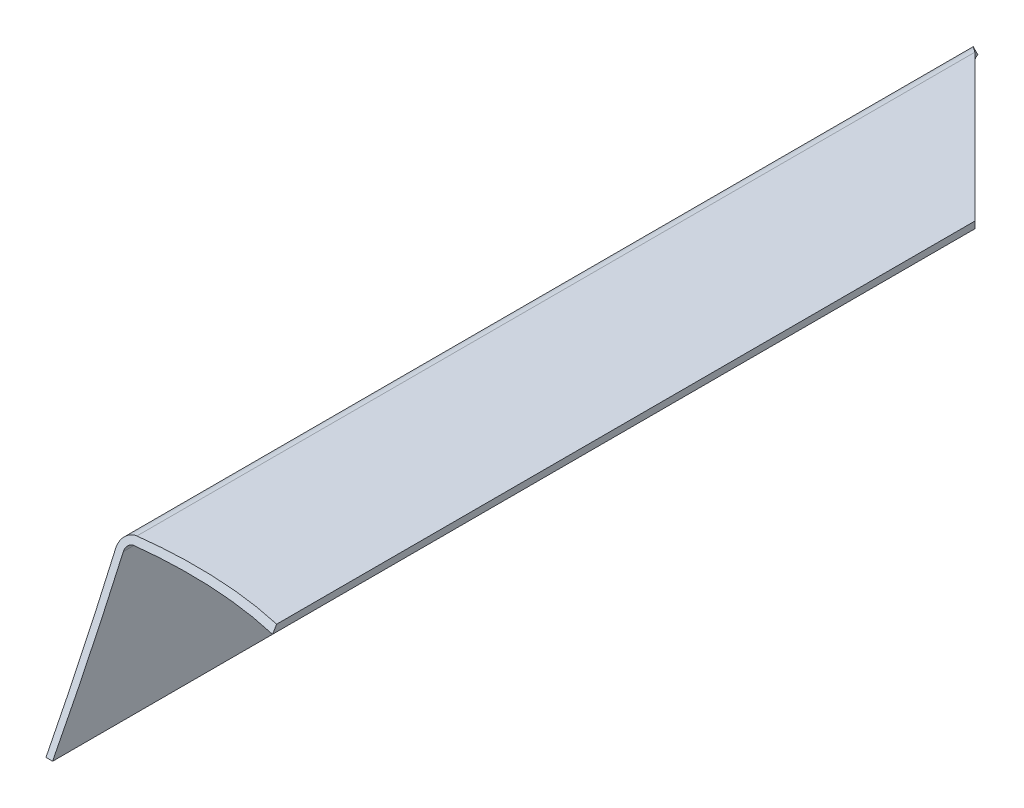
ISO-10303-21;
HEADER;
FILE_DESCRIPTION(('STEP AP214'),'2;1');
FILE_NAME('part.step','',(''),(''),'','','');
FILE_SCHEMA(('AUTOMOTIVE_DESIGN { 1 0 10303 214 1 1 1 1 }'));
ENDSEC;
DATA;
#1=APPLICATION_CONTEXT('core data for automotive mechanical design processes');
#2=APPLICATION_PROTOCOL_DEFINITION('international standard','automotive_design',2000,#1);
#3=PRODUCT_CONTEXT('',#1,'mechanical');
#4=PRODUCT('Part','Part','',(#3));
#5=PRODUCT_RELATED_PRODUCT_CATEGORY('part','',(#4));
#6=PRODUCT_DEFINITION_FORMATION('','',#4);
#7=PRODUCT_DEFINITION_CONTEXT('part definition',#1,'design');
#8=PRODUCT_DEFINITION('design','',#6,#7);
#9=PRODUCT_DEFINITION_SHAPE('','',#8);
#10=(LENGTH_UNIT() NAMED_UNIT(*) SI_UNIT(.MILLI.,.METRE.));
#11=(NAMED_UNIT(*) PLANE_ANGLE_UNIT() SI_UNIT($,.RADIAN.));
#12=(NAMED_UNIT(*) SI_UNIT($,.STERADIAN.) SOLID_ANGLE_UNIT());
#13=UNCERTAINTY_MEASURE_WITH_UNIT(LENGTH_MEASURE(1.E-05),#10,'distance_accuracy_value','');
#14=(GEOMETRIC_REPRESENTATION_CONTEXT(3) GLOBAL_UNCERTAINTY_ASSIGNED_CONTEXT((#13)) GLOBAL_UNIT_ASSIGNED_CONTEXT((#10,
#11,#12)) REPRESENTATION_CONTEXT('',''));
#15=CARTESIAN_POINT('',(0.,0.,0.));
#16=DIRECTION('',(0.,0.,1.));
#17=DIRECTION('',(1.,0.,0.));
#18=AXIS2_PLACEMENT_3D('',#15,#16,#17);
#19=CARTESIAN_POINT('',(-75.3461789999995,0.188336430725022,0.));
#20=DIRECTION('',(-1.,0.,0.));
#21=DIRECTION('',(0.,0.,1.));
#22=AXIS2_PLACEMENT_3D('',#19,#20,#21);
#23=PLANE('',#22);
#24=CARTESIAN_POINT('',(-75.3461790000001,80.0720931223183,64.9810127583872));
#25=DIRECTION('',(-1.,0.,0.));
#26=DIRECTION('',(0.,-0.892228166379723,0.451584874767389));
#27=AXIS2_PLACEMENT_3D('',#24,#25,#26);
#28=ELLIPSE('',#27,110.282499709762,44.45);
#29=CARTESIAN_POINT('',(-75.346179,73.8729789999997,18.7832321067135));
#30=VERTEX_POINT('',#29);
#31=CARTESIAN_POINT('',(-75.3461789999999,57.8815154307375,26.4048597394044));
#32=VERTEX_POINT('',#31);
#33=EDGE_CURVE('E103',#30,#32,#28,.T.);
#34=ORIENTED_EDGE('',*,*,#33,.F.);
#35=DIRECTION('',(0.,0.,-1.));
#36=VECTOR('',#35,1.);
#37=CARTESIAN_POINT('',(-75.346179,73.8729789999997,0.));
#38=LINE('',#37,#36);
#39=CARTESIAN_POINT('',(-75.346179,73.8729789999998,-73.6846425692606));
#40=VERTEX_POINT('',#39);
#41=EDGE_CURVE('E41',#30,#40,#38,.T.);
#42=ORIENTED_EDGE('',*,*,#41,.T.);
#43=DIRECTION('',(0.,0.707106781186615,-0.70710678118648));
#44=VECTOR('',#43,1.);
#45=CARTESIAN_POINT('',(-75.346179,74.7407654307376,-74.5524289999983));
#46=LINE('',#45,#44);
#47=CARTESIAN_POINT('',(-75.3461789999999,57.8815154307376,-57.6931790000015));
#48=VERTEX_POINT('',#47);
#49=EDGE_CURVE('E135',#48,#40,#46,.T.);
#50=ORIENTED_EDGE('',*,*,#49,.F.);
#51=DIRECTION('',(0.,0.,-1.));
#52=VECTOR('',#51,1.);
#53=CARTESIAN_POINT('',(-75.3461789999999,57.8815154307375,57.6931790000015));
#54=LINE('',#53,#52);
#55=EDGE_CURVE('E108',#32,#48,#54,.T.);
#56=ORIENTED_EDGE('',*,*,#55,.F.);
#57=EDGE_LOOP('',(#34,#42,#50,#56));
#58=FACE_BOUND('',#57,.T.);
#59=ADVANCED_FACE('F32',(#58),#23,.T.);
#60=CARTESIAN_POINT('',(-74.6095789999999,57.8815154307375,57.6931790000015));
#61=DIRECTION('',(0.,1.,0.));
#62=DIRECTION('',(0.,0.,1.));
#63=AXIS2_PLACEMENT_3D('',#60,#61,#62);
#64=PLANE('',#63);
#65=DIRECTION('',(0.,0.,-1.));
#66=VECTOR('',#65,1.);
#67=CARTESIAN_POINT('',(-74.6095789999999,57.8815154307375,57.6931790000015));
#68=LINE('',#67,#66);
#69=CARTESIAN_POINT('',(-74.6095789999999,57.8815154307375,26.4270617637596));
#70=VERTEX_POINT('',#69);
#71=CARTESIAN_POINT('',(-74.6095789999999,57.8815154307376,-57.6931790000015));
#72=VERTEX_POINT('',#71);
#73=EDGE_CURVE('E137',#70,#72,#68,.T.);
#74=ORIENTED_EDGE('',*,*,#73,.F.);
#75=CARTESIAN_POINT('',(-86.2996938358006,57.8815154307375,76.2123654834745));
#76=DIRECTION('',(0.,1.,0.));
#77=DIRECTION('',(-0.698196395740364,0.,0.715906273876103));
#78=AXIS2_PLACEMENT_3D('',#75,#76,#77);
#79=ELLIPSE('',#78,54.436662870583,44.45);
#80=EDGE_CURVE('E224',#70,#32,#79,.T.);
#81=ORIENTED_EDGE('',*,*,#80,.T.);
#82=ORIENTED_EDGE('',*,*,#55,.T.);
#83=DIRECTION('',(-1.,0.,0.));
#84=VECTOR('',#83,1.);
#85=CARTESIAN_POINT('',(-74.6095789999999,57.8815154307376,-57.6931790000015));
#86=LINE('',#85,#84);
#87=EDGE_CURVE('E338',#72,#48,#86,.T.);
#88=ORIENTED_EDGE('',*,*,#87,.F.);
#89=EDGE_LOOP('',(#74,#81,#82,#88));
#90=FACE_BOUND('',#89,.T.);
#91=ADVANCED_FACE('F156',(#90),#64,.F.);
#92=CARTESIAN_POINT('',(-74.609579,74.7407654307376,-74.5524289999983));
#93=DIRECTION('',(0.,0.70710678118648,0.707106781186615));
#94=DIRECTION('',(0.,-0.707106781186615,0.70710678118648));
#95=AXIS2_PLACEMENT_3D('',#92,#93,#94);
#96=PLANE('',#95);
#97=CARTESIAN_POINT('',(-74.609579,73.8729789999998,-73.6846425692607));
#98=CARTESIAN_POINT('',(-75.346179,73.8729789999998,-73.6846425692607));
#99=B_SPLINE_CURVE_WITH_KNOTS('',1,(#97,#98),.UNSPECIFIED.,.F.,.F.,(2,2),(0.,1.),.UNSPECIFIED.);
#100=CARTESIAN_POINT('',(-74.609579,73.8729789999998,-73.6846425692607));
#101=VERTEX_POINT('',#100);
#102=EDGE_CURVE('E118',#101,#40,#99,.T.);
#103=ORIENTED_EDGE('',*,*,#102,.F.);
#104=DIRECTION('',(0.,0.707106781186615,-0.70710678118648));
#105=VECTOR('',#104,1.);
#106=CARTESIAN_POINT('',(-74.609579,74.7407654307376,-74.5524289999983));
#107=LINE('',#106,#105);
#108=EDGE_CURVE('E336',#72,#101,#107,.T.);
#109=ORIENTED_EDGE('',*,*,#108,.F.);
#110=ORIENTED_EDGE('',*,*,#87,.T.);
#111=ORIENTED_EDGE('',*,*,#49,.T.);
#112=EDGE_LOOP('',(#103,#109,#110,#111));
#113=FACE_BOUND('',#112,.T.);
#114=ADVANCED_FACE('F146',(#113),#96,.F.);
#115=CARTESIAN_POINT('',(-74.6095789999995,0.188336430725022,0.));
#116=DIRECTION('',(-1.,0.,0.));
#117=DIRECTION('',(0.,0.,1.));
#118=AXIS2_PLACEMENT_3D('',#115,#116,#117);
#119=PLANE('',#118);
#120=DIRECTION('',(0.,0.,-1.));
#121=VECTOR('',#120,1.);
#122=CARTESIAN_POINT('',(-74.609579,73.8729789999997,0.));
#123=LINE('',#122,#121);
#124=CARTESIAN_POINT('',(-74.6095790000001,73.8729789999997,18.6855467140207));
#125=VERTEX_POINT('',#124);
#126=EDGE_CURVE('E35',#125,#101,#123,.T.);
#127=ORIENTED_EDGE('',*,*,#126,.F.);
#128=CARTESIAN_POINT('',(-74.6095790000001,81.5643611086813,64.2257287658682));
#129=DIRECTION('',(-1.,0.,0.));
#130=DIRECTION('',(0.,-0.892228166379723,0.451584874767389));
#131=AXIS2_PLACEMENT_3D('',#128,#129,#130);
#132=ELLIPSE('',#131,110.282499709762,44.45);
#133=EDGE_CURVE('E232',#125,#70,#132,.T.);
#134=ORIENTED_EDGE('',*,*,#133,.T.);
#135=ORIENTED_EDGE('',*,*,#73,.T.);
#136=ORIENTED_EDGE('',*,*,#108,.T.);
#137=EDGE_LOOP('',(#127,#134,#135,#136));
#138=FACE_BOUND('',#137,.T.);
#139=ADVANCED_FACE('F155',(#138),#119,.F.);
#140=CARTESIAN_POINT('',(-57.8815154307379,74.6095789999998,57.6931790000015));
#141=DIRECTION('',(-1.,0.,0.));
#142=DIRECTION('',(0.,0.,-1.));
#143=AXIS2_PLACEMENT_3D('',#140,#141,#142);
#144=PLANE('',#143);
#145=DIRECTION('',(0.,0.,1.));
#146=VECTOR('',#145,1.);
#147=CARTESIAN_POINT('',(-57.8815154307379,75.3461789999998,57.6931790000015));
#148=LINE('',#147,#146);
#149=CARTESIAN_POINT('',(-57.8815154307379,75.3461789999998,-57.6931790000015));
#150=VERTEX_POINT('',#149);
#151=CARTESIAN_POINT('',(-57.8815154307379,75.3461789999998,18.6442200072058));
#152=VERTEX_POINT('',#151);
#153=EDGE_CURVE('E200',#150,#152,#148,.T.);
#154=ORIENTED_EDGE('',*,*,#153,.T.);
#155=CARTESIAN_POINT('',(-57.881515430738,115.45351904821,47.073354831978));
#156=DIRECTION('',(-1.,0.,0.));
#157=DIRECTION('',(0.,-0.892228166379723,0.451584874767388));
#158=AXIS2_PLACEMENT_3D('',#155,#156,#157);
#159=ELLIPSE('',#158,110.282499709763,44.45);
#160=CARTESIAN_POINT('',(-57.8815154307379,74.6095789999998,19.1016816911288));
#161=VERTEX_POINT('',#160);
#162=EDGE_CURVE('E110',#152,#161,#159,.T.);
#163=ORIENTED_EDGE('',*,*,#162,.T.);
#164=DIRECTION('',(0.,0.,1.));
#165=VECTOR('',#164,1.);
#166=CARTESIAN_POINT('',(-57.8815154307379,74.6095789999998,57.6931790000015));
#167=LINE('',#166,#165);
#168=CARTESIAN_POINT('',(-57.8815154307379,74.6095789999998,-57.6931790000015));
#169=VERTEX_POINT('',#168);
#170=EDGE_CURVE('E198',#169,#161,#167,.T.);
#171=ORIENTED_EDGE('',*,*,#170,.F.);
#172=DIRECTION('',(0.,1.,0.));
#173=VECTOR('',#172,1.);
#174=CARTESIAN_POINT('',(-57.8815154307379,74.6095789999998,-57.6931790000015));
#175=LINE('',#174,#173);
#176=EDGE_CURVE('E193',#169,#150,#175,.T.);
#177=ORIENTED_EDGE('',*,*,#176,.T.);
#178=EDGE_LOOP('',(#154,#163,#171,#177));
#179=FACE_BOUND('',#178,.T.);
#180=ADVANCED_FACE('F159',(#179),#144,.F.);
#181=CARTESIAN_POINT('',(-149.29319443075,74.6095789999995,0.));
#182=DIRECTION('',(0.,1.,0.));
#183=DIRECTION('',(0.,0.,1.));
#184=AXIS2_PLACEMENT_3D('',#181,#182,#183);
#185=PLANE('',#184);
#186=ORIENTED_EDGE('',*,*,#170,.T.);
#187=CARTESIAN_POINT('',(-78.0425364500491,74.6095789999997,67.745763803909));
#188=DIRECTION('',(0.,1.,0.));
#189=DIRECTION('',(-0.698196395740361,0.,0.715906273876105));
#190=AXIS2_PLACEMENT_3D('',#187,#188,#189);
#191=ELLIPSE('',#190,54.4366628705829,44.45);
#192=CARTESIAN_POINT('',(-73.872979,74.6095789999997,18.2674087113258));
#193=VERTEX_POINT('',#192);
#194=EDGE_CURVE('E109',#161,#193,#191,.T.);
#195=ORIENTED_EDGE('',*,*,#194,.T.);
#196=DIRECTION('',(0.,0.,-1.));
#197=VECTOR('',#196,1.);
#198=CARTESIAN_POINT('',(-73.872979,74.6095789999997,0.));
#199=LINE('',#198,#197);
#200=CARTESIAN_POINT('',(-73.872979,74.6095789999998,-73.6846425692607));
#201=VERTEX_POINT('',#200);
#202=EDGE_CURVE('E192',#193,#201,#199,.T.);
#203=ORIENTED_EDGE('',*,*,#202,.T.);
#204=DIRECTION('',(0.707106781186614,0.,0.707106781186481));
#205=VECTOR('',#204,1.);
#206=CARTESIAN_POINT('',(-74.7407654307379,74.6095789999998,-74.5524289999983));
#207=LINE('',#206,#205);
#208=EDGE_CURVE('E190',#201,#169,#207,.T.);
#209=ORIENTED_EDGE('',*,*,#208,.T.);
#210=EDGE_LOOP('',(#186,#195,#203,#209));
#211=FACE_BOUND('',#210,.T.);
#212=ADVANCED_FACE('F173',(#211),#185,.F.);
#213=CARTESIAN_POINT('',(-74.7407654307379,74.6095789999998,-74.5524289999983));
#214=DIRECTION('',(-0.707106781186481,0.,0.707106781186614));
#215=DIRECTION('',(-0.707106781186614,0.,-0.707106781186481));
#216=AXIS2_PLACEMENT_3D('',#213,#214,#215);
#217=PLANE('',#216);
#218=ORIENTED_EDGE('',*,*,#208,.F.);
#219=CARTESIAN_POINT('',(-73.872979,75.3461789999998,-73.6846425692607));
#220=CARTESIAN_POINT('',(-73.872979,74.6095789999998,-73.6846425692607));
#221=B_SPLINE_CURVE_WITH_KNOTS('',1,(#219,#220),.UNSPECIFIED.,.F.,.F.,(2,2),(0.,1.),.UNSPECIFIED.);
#222=CARTESIAN_POINT('',(-73.872979,75.3461789999998,-73.6846425692606));
#223=VERTEX_POINT('',#222);
#224=EDGE_CURVE('E213',#201,#223,#221,.F.);
#225=ORIENTED_EDGE('',*,*,#224,.T.);
#226=DIRECTION('',(0.707106781186614,0.,0.707106781186481));
#227=VECTOR('',#226,1.);
#228=CARTESIAN_POINT('',(-74.7407654307379,75.3461789999998,-74.5524289999983));
#229=LINE('',#228,#227);
#230=EDGE_CURVE('E212',#223,#150,#229,.T.);
#231=ORIENTED_EDGE('',*,*,#230,.T.);
#232=ORIENTED_EDGE('',*,*,#176,.F.);
#233=EDGE_LOOP('',(#218,#225,#231,#232));
#234=FACE_BOUND('',#233,.T.);
#235=ADVANCED_FACE('F168',(#234),#217,.F.);
#236=CARTESIAN_POINT('',(-149.29319443075,75.3461789999995,0.));
#237=DIRECTION('',(0.,1.,0.));
#238=DIRECTION('',(0.,0.,1.));
#239=AXIS2_PLACEMENT_3D('',#236,#237,#238);
#240=PLANE('',#239);
#241=CARTESIAN_POINT('',(-77.678942534641,75.3461789999997,67.37294726293));
#242=DIRECTION('',(0.,1.,0.));
#243=DIRECTION('',(-0.698196395740361,0.,0.715906273876105));
#244=AXIS2_PLACEMENT_3D('',#241,#242,#243);
#245=ELLIPSE('',#244,54.4366628705829,44.45);
#246=CARTESIAN_POINT('',(-73.872979,75.3461789999998,17.9387357085153));
#247=VERTEX_POINT('',#246);
#248=EDGE_CURVE('E49',#152,#247,#245,.T.);
#249=ORIENTED_EDGE('',*,*,#248,.F.);
#250=ORIENTED_EDGE('',*,*,#153,.F.);
#251=ORIENTED_EDGE('',*,*,#230,.F.);
#252=DIRECTION('',(0.,0.,-1.));
#253=VECTOR('',#252,1.);
#254=CARTESIAN_POINT('',(-73.872979,75.3461789999998,0.));
#255=LINE('',#254,#253);
#256=EDGE_CURVE('E123',#247,#223,#255,.T.);
#257=ORIENTED_EDGE('',*,*,#256,.F.);
#258=EDGE_LOOP('',(#249,#250,#251,#257));
#259=FACE_BOUND('',#258,.T.);
#260=ADVANCED_FACE('F164',(#259),#240,.T.);
#261=CARTESIAN_POINT('',(-75.346179,73.8729789999998,-73.6846425692607));
#262=CARTESIAN_POINT('',(-75.346179,74.0658426810747,-73.8292903300669));
#263=CARTESIAN_POINT('',(-75.3078355472678,74.2585859832379,-73.9739047128399));
#264=CARTESIAN_POINT('',(-75.1602411073235,74.6149104818822,-74.2631668564191));
#265=CARTESIAN_POINT('',(-75.0510639267768,74.7783134933111,-74.4077812391921));
#266=CARTESIAN_POINT('',(-74.9146887100441,74.9146887100438,-74.5524289999983));
#267=CARTESIAN_POINT('',(-74.609579,73.8729789999998,-73.6846425692607));
#268=CARTESIAN_POINT('',(-74.609579,73.96940506357,-73.829281664616));
#269=CARTESIAN_POINT('',(-74.5904072736339,74.0657824916188,-73.9739047128399));
#270=CARTESIAN_POINT('',(-74.5166100536618,74.243944740941,-74.2631668564191));
#271=CARTESIAN_POINT('',(-74.4620173784557,74.3256503315882,-74.407789904643));
#272=CARTESIAN_POINT('',(-74.3938338550221,74.3938338550218,-74.5524289999983));
#273=B_SPLINE_SURFACE_WITH_KNOTS('',1,3,((#261,#262,#263,#264,#265,#266),(#267,#268,#269,#270,
#271,#272)),.UNSPECIFIED.,.F.,.F.,.F.,(2,2),(4,2,4),(0.,1.),(0.,0.5,1.),.UNSPECIFIED.);
#274=CARTESIAN_POINT('',(-75.346179,73.8729789999998,-73.6846425692607));
#275=CARTESIAN_POINT('',(-75.346179,74.0658426810747,-73.8292903300669));
#276=CARTESIAN_POINT('',(-75.3078355472678,74.2585859832379,-73.9739047128399));
#277=CARTESIAN_POINT('',(-75.1602411073235,74.6149104818822,-74.2631668564191));
#278=CARTESIAN_POINT('',(-75.0510639267768,74.7783134933111,-74.4077812391921));
#279=CARTESIAN_POINT('',(-74.9146887100441,74.9146887100438,-74.5524289999983));
#280=B_SPLINE_CURVE_WITH_KNOTS('',3,(#274,#275,#276,#277,#278,#279),.UNSPECIFIED.,.F.,.F.,(4,2,
4),(0.,0.5,1.),.UNSPECIFIED.);
#281=CARTESIAN_POINT('',(-74.9146889457464,74.9146884743413,-74.5524287499982));
#282=VERTEX_POINT('',#281);
#283=EDGE_CURVE('E116',#40,#282,#280,.T.);
#284=CARTESIAN_POINT('',(-74.9146887100441,74.9146887100438,-74.5524289999983));
#285=CARTESIAN_POINT('',(-74.3938338550221,74.3938338550218,-74.5524289999983));
#286=B_SPLINE_CURVE_WITH_KNOTS('',1,(#284,#285),.UNSPECIFIED.,.F.,.F.,(2,2),(0.,1.),.UNSPECIFIED.);
#287=CARTESIAN_POINT('',(-74.3938338550221,74.3938338550218,-74.5524289999983));
#288=VERTEX_POINT('',#287);
#289=EDGE_CURVE('E354',#282,#288,#286,.T.);
#290=CARTESIAN_POINT('',(-74.3938338550221,74.3938338550218,-74.5524289999983));
#291=CARTESIAN_POINT('',(-74.4620173784557,74.3256503315882,-74.407789904643));
#292=CARTESIAN_POINT('',(-74.5166100536618,74.243944740941,-74.2631668564191));
#293=CARTESIAN_POINT('',(-74.5904072736339,74.0657824916188,-73.9739047128399));
#294=CARTESIAN_POINT('',(-74.609579,73.96940506357,-73.829281664616));
#295=CARTESIAN_POINT('',(-74.609579,73.8729789999998,-73.6846425692607));
#296=B_SPLINE_CURVE_WITH_KNOTS('',3,(#290,#291,#292,#293,#294,#295),.UNSPECIFIED.,.F.,.F.,(4,2,
4),(0.,0.5,1.),.UNSPECIFIED.);
#297=EDGE_CURVE('E349',#101,#288,#296,.F.);
#298=ORIENTED_EDGE('',*,*,#102,.T.);
#299=ORIENTED_EDGE('',*,*,#283,.T.);
#300=ORIENTED_EDGE('',*,*,#289,.T.);
#301=ORIENTED_EDGE('',*,*,#297,.F.);
#302=EDGE_LOOP('',(#298,#299,#300,#301));
#303=FACE_BOUND('',#302,.T.);
#304=ADVANCED_FACE('F167',(#303),#273,.F.);
#305=CARTESIAN_POINT('',(-74.9146887100441,74.9146887100438,-74.5524289999983));
#306=CARTESIAN_POINT('',(-74.7783134933113,75.0510639267765,-74.4077812391921));
#307=CARTESIAN_POINT('',(-74.6149104818825,75.1602411073232,-74.2631668564191));
#308=CARTESIAN_POINT('',(-74.2585859832381,75.3078355472675,-73.9739047128399));
#309=CARTESIAN_POINT('',(-74.065842681075,75.3461789999998,-73.8292903300669));
#310=CARTESIAN_POINT('',(-73.872979,75.3461789999998,-73.6846425692607));
#311=CARTESIAN_POINT('',(-74.3938338550221,74.3938338550218,-74.5524289999983));
#312=CARTESIAN_POINT('',(-74.3256503315884,74.4620173784554,-74.407789904643));
#313=CARTESIAN_POINT('',(-74.2439447409412,74.5166100536615,-74.2631668564191));
#314=CARTESIAN_POINT('',(-74.0657824916191,74.5904072736337,-73.9739047128399));
#315=CARTESIAN_POINT('',(-73.9694050635702,74.6095789999998,-73.8292816646159));
#316=CARTESIAN_POINT('',(-73.872979,74.6095789999998,-73.6846425692607));
#317=B_SPLINE_SURFACE_WITH_KNOTS('',1,3,((#305,#306,#307,#308,#309,#310),(#311,#312,#313,#314,
#315,#316)),.UNSPECIFIED.,.F.,.F.,.F.,(2,2),(4,2,4),(0.,1.),(0.,0.5,1.),.UNSPECIFIED.);
#318=CARTESIAN_POINT('',(-74.9146887100441,74.9146887100438,-74.5524289999983));
#319=CARTESIAN_POINT('',(-74.7783134933113,75.0510639267765,-74.4077812391921));
#320=CARTESIAN_POINT('',(-74.6149104818825,75.1602411073232,-74.2631668564191));
#321=CARTESIAN_POINT('',(-74.2585859832381,75.3078355472675,-73.9739047128399));
#322=CARTESIAN_POINT('',(-74.065842681075,75.3461789999998,-73.8292903300669));
#323=CARTESIAN_POINT('',(-73.872979,75.3461789999998,-73.6846425692607));
#324=B_SPLINE_CURVE_WITH_KNOTS('',3,(#318,#319,#320,#321,#322,#323),.UNSPECIFIED.,.F.,.F.,(4,2,
4),(0.,0.5,1.),.UNSPECIFIED.);
#325=EDGE_CURVE('E346',#282,#223,#324,.T.);
#326=CARTESIAN_POINT('',(-73.872979,74.6095789999998,-73.6846425692607));
#327=CARTESIAN_POINT('',(-73.9694050635702,74.6095789999998,-73.8292816646159));
#328=CARTESIAN_POINT('',(-74.0657824916191,74.5904072736337,-73.9739047128399));
#329=CARTESIAN_POINT('',(-74.2439447409412,74.5166100536615,-74.2631668564191));
#330=CARTESIAN_POINT('',(-74.3256503315884,74.4620173784554,-74.407789904643));
#331=CARTESIAN_POINT('',(-74.3938338550221,74.3938338550218,-74.5524289999983));
#332=B_SPLINE_CURVE_WITH_KNOTS('',3,(#326,#327,#328,#329,#330,#331),.UNSPECIFIED.,.F.,.F.,(4,2,
4),(0.,0.5,1.),.UNSPECIFIED.);
#333=EDGE_CURVE('E351',#288,#201,#332,.F.);
#334=ORIENTED_EDGE('',*,*,#289,.F.);
#335=ORIENTED_EDGE('',*,*,#325,.T.);
#336=ORIENTED_EDGE('',*,*,#224,.F.);
#337=ORIENTED_EDGE('',*,*,#333,.F.);
#338=EDGE_LOOP('',(#334,#335,#336,#337));
#339=FACE_BOUND('',#338,.T.);
#340=ADVANCED_FACE('F283',(#339),#317,.F.);
#341=CARTESIAN_POINT('',(-73.8729790000001,73.8729789999997,149.116777969203));
#342=DIRECTION('',(0.,0.,-1.));
#343=DIRECTION('',(1.,0.,0.));
#344=AXIS2_PLACEMENT_3D('',#341,#342,#343);
#345=CYLINDRICAL_SURFACE('',#344,0.7366);
#346=CARTESIAN_POINT('',(-74.6095790000001,73.8729789999997,18.6855467140207));
#347=CARTESIAN_POINT('',(-74.6095943201483,73.9186551366668,18.6652567421936));
#348=CARTESIAN_POINT('',(-74.6053324009751,73.9641163038431,18.6445370673236));
#349=CARTESIAN_POINT('',(-74.5885834489246,74.0533859835001,18.6028043750663));
#350=CARTESIAN_POINT('',(-74.5760928067191,74.0971937618431,18.5817912329174));
#351=CARTESIAN_POINT('',(-74.5432120191225,74.1819028102991,18.5400510016767));
#352=CARTESIAN_POINT('',(-74.5228197965295,74.222803312786,18.519323989289));
#353=CARTESIAN_POINT('',(-74.4745907379878,74.3004479361403,18.4787691633085));
#354=CARTESIAN_POINT('',(-74.4467562684295,74.337193372907,18.4589410662297));
#355=CARTESIAN_POINT('',(-74.3846954357096,74.404767699803,18.4211146130855));
#356=CARTESIAN_POINT('',(-74.3505705203612,74.4356766080297,18.4030933909283));
#357=CARTESIAN_POINT('',(-74.2764204211235,74.4910011704622,18.3692297643686));
#358=CARTESIAN_POINT('',(-74.2363945354302,74.5154160513613,18.3533876195582));
#359=CARTESIAN_POINT('',(-74.154770296772,74.5549431081454,18.3257124899579));
#360=CARTESIAN_POINT('',(-74.1135150270795,74.5706156551517,18.3136679296665));
#361=CARTESIAN_POINT('',(-74.0281903555795,74.5943921374127,18.2926958882941));
#362=CARTESIAN_POINT('',(-73.9841299002174,74.602518961323,18.2837590324556));
#363=CARTESIAN_POINT('',(-73.9284619994974,74.6075708614714,18.2748707750225));
#364=CARTESIAN_POINT('',(-73.9173936108588,74.6083230700746,18.273219746304));
#365=CARTESIAN_POINT('',(-73.895216000279,74.6093264072419,18.2701442598754));
#366=CARTESIAN_POINT('',(-73.8841068411649,74.6095781202972,18.2687195396687));
#367=CARTESIAN_POINT('',(-73.872979,74.6095789999998,18.2674087113258));
#368=B_SPLINE_CURVE_WITH_KNOTS('',3,(#346,#347,#348,#349,#350,#351,#352,#353,#354,#355,#356,
#357,#358,#359,#360,#361,#362,#363,#364,#365,#366,#367),.UNSPECIFIED.,.F.,.F.,(4,2,2,2,2,2,2,2,
2,2,4),(0.,0.149728864464442,0.299523447600036,0.449357436132397,0.599143838912774,
0.746697821373696,0.8942693666533,1.03077299500879,1.16686119724074,1.20050108768982,
1.23410166950718),.UNSPECIFIED.);
#369=EDGE_CURVE('E226',#125,#193,#368,.T.);
#370=ORIENTED_EDGE('',*,*,#369,.F.);
#371=ORIENTED_EDGE('',*,*,#126,.T.);
#372=ORIENTED_EDGE('',*,*,#297,.T.);
#373=ORIENTED_EDGE('',*,*,#333,.T.);
#374=ORIENTED_EDGE('',*,*,#202,.F.);
#375=EDGE_LOOP('',(#370,#371,#372,#373,#374));
#376=FACE_BOUND('',#375,.T.);
#377=ADVANCED_FACE('F234',(#376),#345,.F.);
#378=CARTESIAN_POINT('',(-73.8729790000001,73.8729789999997,149.116777969203));
#379=DIRECTION('',(0.,0.,-1.));
#380=DIRECTION('',(1.,0.,0.));
#381=AXIS2_PLACEMENT_3D('',#378,#379,#380);
#382=CYLINDRICAL_SURFACE('',#381,1.4732);
#383=ORIENTED_EDGE('',*,*,#41,.F.);
#384=CARTESIAN_POINT('',(-75.346179,73.8729789999997,18.7832321067135));
#385=CARTESIAN_POINT('',(-75.3462118113802,73.9643135130021,18.7433302791065));
#386=CARTESIAN_POINT('',(-75.3376897980802,74.0551743947938,18.7024795621995));
#387=CARTESIAN_POINT('',(-75.3042578600148,74.2334776800888,18.6199880900648));
#388=CARTESIAN_POINT('',(-75.2793461925638,74.3209197190244,18.5783472512819));
#389=CARTESIAN_POINT('',(-75.2138535430092,74.4899025015656,18.4953878759392));
#390=CARTESIAN_POINT('',(-75.1732709142135,74.571442623933,18.4540693737159));
#391=CARTESIAN_POINT('',(-75.0773890970785,74.726205034767,18.372947560815));
#392=CARTESIAN_POINT('',(-75.0220928553736,74.7994289844942,18.3331439485792));
#393=CARTESIAN_POINT('',(-74.8985119977729,74.9345392377153,18.2566781498788));
#394=CARTESIAN_POINT('',(-74.8303454302693,74.9965192593623,18.2199914942421));
#395=CARTESIAN_POINT('',(-74.682212846935,75.1074880227557,18.150773314312));
#396=CARTESIAN_POINT('',(-74.6022447897395,75.1564745128347,18.1182425106977));
#397=CARTESIAN_POINT('',(-74.4387256515828,75.236039415699,18.0610142591437));
#398=CARTESIAN_POINT('',(-74.355824523312,75.2676720363489,18.035926270269));
#399=CARTESIAN_POINT('',(-74.1842612413201,75.3156499394588,17.9920550409572));
#400=CARTESIAN_POINT('',(-74.095618015747,75.3320429630909,17.9732522302652));
#401=CARTESIAN_POINT('',(-73.9837514615476,75.3421766499348,17.9544810964606));
#402=CARTESIAN_POINT('',(-73.9616570139841,75.3436756559218,17.9510096969112));
#403=CARTESIAN_POINT('',(-73.9173811636634,75.3456753916897,17.9445270807053));
#404=CARTESIAN_POINT('',(-73.8951998864895,75.3461772411437,17.9415153514141));
#405=CARTESIAN_POINT('',(-73.872979,75.3461789999998,17.9387357085153));
#406=B_SPLINE_CURVE_WITH_KNOTS('',3,(#384,#385,#386,#387,#388,#389,#390,#391,#392,#393,#394,
#395,#396,#397,#398,#399,#400,#401,#402,#403,#404,#405),.UNSPECIFIED.,.F.,.F.,(4,2,2,2,2,2,2,2,
2,2,4),(0.,0.298571504825975,0.5971747614142,0.895809403535863,1.19438428428839,
1.49034307292546,1.78635311521891,2.0614966753208,2.33577535801372,2.40300550994818,
2.47016012866909),.UNSPECIFIED.);
#407=EDGE_CURVE('E11',#30,#247,#406,.T.);
#408=ORIENTED_EDGE('',*,*,#407,.T.);
#409=ORIENTED_EDGE('',*,*,#256,.T.);
#410=ORIENTED_EDGE('',*,*,#325,.F.);
#411=ORIENTED_EDGE('',*,*,#283,.F.);
#412=EDGE_LOOP('',(#383,#408,#409,#410,#411));
#413=FACE_BOUND('',#412,.T.);
#414=ADVANCED_FACE('F113',(#413),#382,.T.);
#415=CARTESIAN_POINT('',(-50.8199349555743,129.75947951008,39.8326560880521));
#416=DIRECTION('',(-0.403055789603802,-0.81654527768675,0.413279372766563));
#417=DIRECTION('',(0.,-0.451584874767387,-0.892228166379723));
#418=AXIS2_PLACEMENT_3D('',#415,#416,#417);
#419=CYLINDRICAL_SURFACE('',#418,44.45);
#420=ORIENTED_EDGE('',*,*,#369,.T.);
#421=ORIENTED_EDGE('',*,*,#194,.F.);
#422=ORIENTED_EDGE('',*,*,#162,.F.);
#423=ORIENTED_EDGE('',*,*,#248,.T.);
#424=ORIENTED_EDGE('',*,*,#407,.F.);
#425=ORIENTED_EDGE('',*,*,#33,.T.);
#426=ORIENTED_EDGE('',*,*,#80,.F.);
#427=ORIENTED_EDGE('',*,*,#133,.F.);
#428=EDGE_LOOP('',(#420,#421,#422,#423,#424,#425,#426,#427));
#429=FACE_BOUND('',#428,.T.);
#430=ADVANCED_FACE('F102',(#429),#419,.F.);
#431=CLOSED_SHELL('',(#59,#91,#114,#139,#180,#212,#235,#260,#304,#340,#377,#414,#430));
#432=MANIFOLD_SOLID_BREP('B2',#431);
#433=ADVANCED_BREP_SHAPE_REPRESENTATION('',(#18,#432),#14);
#434=SHAPE_DEFINITION_REPRESENTATION(#9,#433);
ENDSEC;
END-ISO-10303-21;
